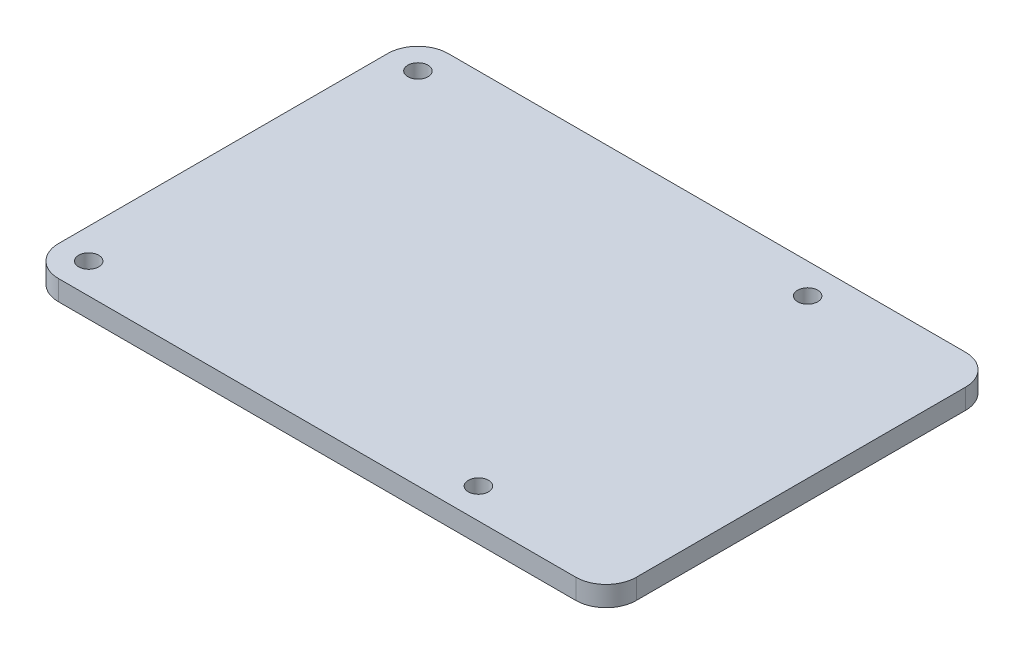
ISO-10303-21;
HEADER;
FILE_DESCRIPTION(('STEP AP214'),'2;1');
FILE_NAME('part.step','',(''),(''),'','','');
FILE_SCHEMA(('AUTOMOTIVE_DESIGN { 1 0 10303 214 1 1 1 1 }'));
ENDSEC;
DATA;
#1=APPLICATION_CONTEXT('core data for automotive mechanical design processes');
#2=APPLICATION_PROTOCOL_DEFINITION('international standard','automotive_design',2000,#1);
#3=PRODUCT_CONTEXT('',#1,'mechanical');
#4=PRODUCT('Part','Part','',(#3));
#5=PRODUCT_RELATED_PRODUCT_CATEGORY('part','',(#4));
#6=PRODUCT_DEFINITION_FORMATION('','',#4);
#7=PRODUCT_DEFINITION_CONTEXT('part definition',#1,'design');
#8=PRODUCT_DEFINITION('design','',#6,#7);
#9=PRODUCT_DEFINITION_SHAPE('','',#8);
#10=(LENGTH_UNIT() NAMED_UNIT(*) SI_UNIT(.MILLI.,.METRE.));
#11=(NAMED_UNIT(*) PLANE_ANGLE_UNIT() SI_UNIT($,.RADIAN.));
#12=(NAMED_UNIT(*) SI_UNIT($,.STERADIAN.) SOLID_ANGLE_UNIT());
#13=UNCERTAINTY_MEASURE_WITH_UNIT(LENGTH_MEASURE(1.E-05),#10,'distance_accuracy_value','');
#14=(GEOMETRIC_REPRESENTATION_CONTEXT(3) GLOBAL_UNCERTAINTY_ASSIGNED_CONTEXT((#13)) GLOBAL_UNIT_ASSIGNED_CONTEXT((#10,
#11,#12)) REPRESENTATION_CONTEXT('',''));
#15=CARTESIAN_POINT('',(0.,0.,0.));
#16=DIRECTION('',(0.,0.,1.));
#17=DIRECTION('',(1.,0.,0.));
#18=AXIS2_PLACEMENT_3D('',#15,#16,#17);
#19=CARTESIAN_POINT('',(39.4233867413842,3.,7.76723290820551));
#20=DIRECTION('',(0.,-1.,0.));
#21=DIRECTION('',(0.,0.,-1.));
#22=AXIS2_PLACEMENT_3D('',#19,#20,#21);
#23=PLANE('',#22);
#24=CARTESIAN_POINT('',(39.4233867413842,3.,7.76723290820551));
#25=DIRECTION('',(0.,1.,0.));
#26=DIRECTION('',(0.,0.,-1.));
#27=AXIS2_PLACEMENT_3D('',#24,#25,#26);
#28=CIRCLE('',#27,4.5);
#29=CARTESIAN_POINT('',(39.4233867413842,3.,12.2672329082055));
#30=VERTEX_POINT('',#29);
#31=CARTESIAN_POINT('',(43.9233867413842,3.,7.76723290820548));
#32=VERTEX_POINT('',#31);
#33=EDGE_CURVE('E164',#30,#32,#28,.T.);
#34=ORIENTED_EDGE('',*,*,#33,.T.);
#35=DIRECTION('',(0.,0.,-1.));
#36=VECTOR('',#35,1.);
#37=CARTESIAN_POINT('',(43.9233867413842,3.,-41.2327670917945));
#38=LINE('',#37,#36);
#39=CARTESIAN_POINT('',(43.9233867413842,3.,-41.2327670917945));
#40=VERTEX_POINT('',#39);
#41=EDGE_CURVE('E100',#32,#40,#38,.T.);
#42=ORIENTED_EDGE('',*,*,#41,.T.);
#43=CARTESIAN_POINT('',(39.4233867413842,3.,-41.2327670917945));
#44=DIRECTION('',(0.,1.,0.));
#45=DIRECTION('',(0.,0.,1.));
#46=AXIS2_PLACEMENT_3D('',#43,#44,#45);
#47=CIRCLE('',#46,4.5);
#48=CARTESIAN_POINT('',(39.4233867413842,3.,-45.7327670917945));
#49=VERTEX_POINT('',#48);
#50=EDGE_CURVE('E185',#40,#49,#47,.T.);
#51=ORIENTED_EDGE('',*,*,#50,.T.);
#52=DIRECTION('',(-1.,0.,0.));
#53=VECTOR('',#52,1.);
#54=CARTESIAN_POINT('',(-37.5766132586158,3.,-45.7327670917945));
#55=LINE('',#54,#53);
#56=CARTESIAN_POINT('',(-37.5766132586158,3.,-45.7327670917945));
#57=VERTEX_POINT('',#56);
#58=EDGE_CURVE('E199',#49,#57,#55,.T.);
#59=ORIENTED_EDGE('',*,*,#58,.T.);
#60=CARTESIAN_POINT('',(-37.5766132586158,3.,-41.2327670917945));
#61=DIRECTION('',(0.,1.,0.));
#62=DIRECTION('',(0.,0.,1.));
#63=AXIS2_PLACEMENT_3D('',#60,#61,#62);
#64=CIRCLE('',#63,4.5);
#65=CARTESIAN_POINT('',(-42.0766132586158,3.,-41.2327670917945));
#66=VERTEX_POINT('',#65);
#67=EDGE_CURVE('E119',#57,#66,#64,.T.);
#68=ORIENTED_EDGE('',*,*,#67,.T.);
#69=DIRECTION('',(0.,0.,1.));
#70=VECTOR('',#69,1.);
#71=CARTESIAN_POINT('',(-42.0766132586158,3.,7.76723290820551));
#72=LINE('',#71,#70);
#73=CARTESIAN_POINT('',(-42.0766132586158,3.,7.76723290820551));
#74=VERTEX_POINT('',#73);
#75=EDGE_CURVE('E113',#66,#74,#72,.T.);
#76=ORIENTED_EDGE('',*,*,#75,.T.);
#77=CARTESIAN_POINT('',(-37.5766132586158,3.,7.76723290820551));
#78=DIRECTION('',(0.,1.,0.));
#79=DIRECTION('',(0.,0.,1.));
#80=AXIS2_PLACEMENT_3D('',#77,#78,#79);
#81=CIRCLE('',#80,4.5);
#82=CARTESIAN_POINT('',(-37.5766132586158,3.,12.2672329082055));
#83=VERTEX_POINT('',#82);
#84=EDGE_CURVE('E117',#74,#83,#81,.T.);
#85=ORIENTED_EDGE('',*,*,#84,.T.);
#86=DIRECTION('',(1.,0.,0.));
#87=VECTOR('',#86,1.);
#88=CARTESIAN_POINT('',(-37.5766132586158,3.,12.2672329082055));
#89=LINE('',#88,#87);
#90=EDGE_CURVE('E57',#83,#30,#89,.T.);
#91=ORIENTED_EDGE('',*,*,#90,.T.);
#92=EDGE_LOOP('',(#34,#42,#51,#59,#68,#76,#85,#91));
#93=FACE_BOUND('',#92,.T.);
#94=CARTESIAN_POINT('',(-37.5766132586158,3.,-41.2327670917945));
#95=DIRECTION('',(0.,1.,0.));
#96=DIRECTION('',(0.,0.,1.));
#97=AXIS2_PLACEMENT_3D('',#94,#95,#96);
#98=CIRCLE('',#97,1.5);
#99=CARTESIAN_POINT('',(-37.5766132586158,3.,-39.7327670917945));
#100=VERTEX_POINT('',#99);
#101=EDGE_CURVE('E146',#100,#100,#98,.T.);
#102=ORIENTED_EDGE('',*,*,#101,.F.);
#103=EDGE_LOOP('',(#102));
#104=FACE_BOUND('',#103,.T.);
#105=CARTESIAN_POINT('',(20.4233867413842,3.,-41.2327670917945));
#106=DIRECTION('',(0.,1.,0.));
#107=DIRECTION('',(0.,0.,1.));
#108=AXIS2_PLACEMENT_3D('',#105,#106,#107);
#109=CIRCLE('',#108,1.5);
#110=CARTESIAN_POINT('',(20.4233867413842,3.,-39.7327670917945));
#111=VERTEX_POINT('',#110);
#112=EDGE_CURVE('E213',#111,#111,#109,.T.);
#113=ORIENTED_EDGE('',*,*,#112,.F.);
#114=EDGE_LOOP('',(#113));
#115=FACE_BOUND('',#114,.T.);
#116=CARTESIAN_POINT('',(-37.5766132586158,3.,7.76723290820551));
#117=DIRECTION('',(0.,1.,0.));
#118=DIRECTION('',(0.,0.,1.));
#119=AXIS2_PLACEMENT_3D('',#116,#117,#118);
#120=CIRCLE('',#119,1.5);
#121=CARTESIAN_POINT('',(-37.5766132586158,3.,9.26723290820551));
#122=VERTEX_POINT('',#121);
#123=EDGE_CURVE('E221',#122,#122,#120,.T.);
#124=ORIENTED_EDGE('',*,*,#123,.F.);
#125=EDGE_LOOP('',(#124));
#126=FACE_BOUND('',#125,.T.);
#127=CARTESIAN_POINT('',(20.4233867413842,3.,7.76723290820551));
#128=DIRECTION('',(0.,1.,0.));
#129=DIRECTION('',(0.,0.,1.));
#130=AXIS2_PLACEMENT_3D('',#127,#128,#129);
#131=CIRCLE('',#130,1.5);
#132=CARTESIAN_POINT('',(20.4233867413842,3.,9.26723290820551));
#133=VERTEX_POINT('',#132);
#134=EDGE_CURVE('E229',#133,#133,#131,.T.);
#135=ORIENTED_EDGE('',*,*,#134,.F.);
#136=EDGE_LOOP('',(#135));
#137=FACE_BOUND('',#136,.T.);
#138=ADVANCED_FACE('F39',(#93,#104,#115,#126,#137),#23,.F.);
#139=CARTESIAN_POINT('',(39.4233867413842,0.,7.76723290820551));
#140=DIRECTION('',(0.,-1.,0.));
#141=DIRECTION('',(0.,0.,-1.));
#142=AXIS2_PLACEMENT_3D('',#139,#140,#141);
#143=PLANE('',#142);
#144=CARTESIAN_POINT('',(-37.5766132586158,0.,7.76723290820551));
#145=DIRECTION('',(0.,1.,0.));
#146=DIRECTION('',(0.,0.,1.));
#147=AXIS2_PLACEMENT_3D('',#144,#145,#146);
#148=CIRCLE('',#147,1.5);
#149=CARTESIAN_POINT('',(-37.5766132586158,0.,9.26723290820551));
#150=VERTEX_POINT('',#149);
#151=EDGE_CURVE('E225',#150,#150,#148,.T.);
#152=ORIENTED_EDGE('',*,*,#151,.T.);
#153=EDGE_LOOP('',(#152));
#154=FACE_BOUND('',#153,.T.);
#155=CARTESIAN_POINT('',(-37.5766132586158,0.,-41.2327670917945));
#156=DIRECTION('',(0.,1.,0.));
#157=DIRECTION('',(0.,0.,1.));
#158=AXIS2_PLACEMENT_3D('',#155,#156,#157);
#159=CIRCLE('',#158,1.5);
#160=CARTESIAN_POINT('',(-37.5766132586158,0.,-39.7327670917945));
#161=VERTEX_POINT('',#160);
#162=EDGE_CURVE('E209',#161,#161,#159,.T.);
#163=ORIENTED_EDGE('',*,*,#162,.T.);
#164=EDGE_LOOP('',(#163));
#165=FACE_BOUND('',#164,.T.);
#166=CARTESIAN_POINT('',(39.4233867413842,0.,7.76723290820551));
#167=DIRECTION('',(0.,1.,0.));
#168=DIRECTION('',(0.,0.,-1.));
#169=AXIS2_PLACEMENT_3D('',#166,#167,#168);
#170=CIRCLE('',#169,4.5);
#171=CARTESIAN_POINT('',(39.4233867413842,0.,12.2672329082055));
#172=VERTEX_POINT('',#171);
#173=CARTESIAN_POINT('',(43.9233867413842,0.,7.76723290820548));
#174=VERTEX_POINT('',#173);
#175=EDGE_CURVE('E141',#172,#174,#170,.T.);
#176=ORIENTED_EDGE('',*,*,#175,.F.);
#177=DIRECTION('',(1.,0.,0.));
#178=VECTOR('',#177,1.);
#179=CARTESIAN_POINT('',(-37.5766132586158,0.,12.2672329082055));
#180=LINE('',#179,#178);
#181=CARTESIAN_POINT('',(-37.5766132586158,0.,12.2672329082055));
#182=VERTEX_POINT('',#181);
#183=EDGE_CURVE('E92',#182,#172,#180,.T.);
#184=ORIENTED_EDGE('',*,*,#183,.F.);
#185=CARTESIAN_POINT('',(-37.5766132586158,0.,7.76723290820551));
#186=DIRECTION('',(0.,1.,0.));
#187=DIRECTION('',(0.,0.,1.));
#188=AXIS2_PLACEMENT_3D('',#185,#186,#187);
#189=CIRCLE('',#188,4.5);
#190=CARTESIAN_POINT('',(-42.0766132586158,0.,7.76723290820551));
#191=VERTEX_POINT('',#190);
#192=EDGE_CURVE('E86',#191,#182,#189,.T.);
#193=ORIENTED_EDGE('',*,*,#192,.F.);
#194=DIRECTION('',(0.,0.,1.));
#195=VECTOR('',#194,1.);
#196=CARTESIAN_POINT('',(-42.0766132586158,0.,7.76723290820551));
#197=LINE('',#196,#195);
#198=CARTESIAN_POINT('',(-42.0766132586158,0.,-41.2327670917945));
#199=VERTEX_POINT('',#198);
#200=EDGE_CURVE('E128',#199,#191,#197,.T.);
#201=ORIENTED_EDGE('',*,*,#200,.F.);
#202=CARTESIAN_POINT('',(-37.5766132586158,0.,-41.2327670917945));
#203=DIRECTION('',(0.,1.,0.));
#204=DIRECTION('',(0.,0.,1.));
#205=AXIS2_PLACEMENT_3D('',#202,#203,#204);
#206=CIRCLE('',#205,4.5);
#207=CARTESIAN_POINT('',(-37.5766132586158,0.,-45.7327670917945));
#208=VERTEX_POINT('',#207);
#209=EDGE_CURVE('E155',#208,#199,#206,.T.);
#210=ORIENTED_EDGE('',*,*,#209,.F.);
#211=DIRECTION('',(-1.,0.,0.));
#212=VECTOR('',#211,1.);
#213=CARTESIAN_POINT('',(-37.5766132586158,0.,-45.7327670917945));
#214=LINE('',#213,#212);
#215=CARTESIAN_POINT('',(39.4233867413842,0.,-45.7327670917945));
#216=VERTEX_POINT('',#215);
#217=EDGE_CURVE('E152',#216,#208,#214,.T.);
#218=ORIENTED_EDGE('',*,*,#217,.F.);
#219=CARTESIAN_POINT('',(39.4233867413842,0.,-41.2327670917945));
#220=DIRECTION('',(0.,1.,0.));
#221=DIRECTION('',(0.,0.,1.));
#222=AXIS2_PLACEMENT_3D('',#219,#220,#221);
#223=CIRCLE('',#222,4.5);
#224=CARTESIAN_POINT('',(43.9233867413842,0.,-41.2327670917945));
#225=VERTEX_POINT('',#224);
#226=EDGE_CURVE('E149',#225,#216,#223,.T.);
#227=ORIENTED_EDGE('',*,*,#226,.F.);
#228=DIRECTION('',(0.,0.,-1.));
#229=VECTOR('',#228,1.);
#230=CARTESIAN_POINT('',(43.9233867413842,0.,-41.2327670917945));
#231=LINE('',#230,#229);
#232=EDGE_CURVE('E145',#174,#225,#231,.T.);
#233=ORIENTED_EDGE('',*,*,#232,.F.);
#234=EDGE_LOOP('',(#176,#184,#193,#201,#210,#218,#227,#233));
#235=FACE_BOUND('',#234,.T.);
#236=CARTESIAN_POINT('',(20.4233867413842,0.,-41.2327670917945));
#237=DIRECTION('',(0.,1.,0.));
#238=DIRECTION('',(0.,0.,1.));
#239=AXIS2_PLACEMENT_3D('',#236,#237,#238);
#240=CIRCLE('',#239,1.5);
#241=CARTESIAN_POINT('',(20.4233867413842,0.,-39.7327670917945));
#242=VERTEX_POINT('',#241);
#243=EDGE_CURVE('E217',#242,#242,#240,.T.);
#244=ORIENTED_EDGE('',*,*,#243,.T.);
#245=EDGE_LOOP('',(#244));
#246=FACE_BOUND('',#245,.T.);
#247=CARTESIAN_POINT('',(20.4233867413842,0.,7.76723290820551));
#248=DIRECTION('',(0.,1.,0.));
#249=DIRECTION('',(0.,0.,1.));
#250=AXIS2_PLACEMENT_3D('',#247,#248,#249);
#251=CIRCLE('',#250,1.5);
#252=CARTESIAN_POINT('',(20.4233867413842,0.,9.26723290820551));
#253=VERTEX_POINT('',#252);
#254=EDGE_CURVE('E233',#253,#253,#251,.T.);
#255=ORIENTED_EDGE('',*,*,#254,.T.);
#256=EDGE_LOOP('',(#255));
#257=FACE_BOUND('',#256,.T.);
#258=ADVANCED_FACE('F189',(#154,#165,#235,#246,#257),#143,.T.);
#259=CARTESIAN_POINT('',(39.4233867413842,3.,7.76723290820551));
#260=DIRECTION('',(0.,-1.,0.));
#261=DIRECTION('',(0.,0.,-1.));
#262=AXIS2_PLACEMENT_3D('',#259,#260,#261);
#263=CYLINDRICAL_SURFACE('',#262,4.5);
#264=ORIENTED_EDGE('',*,*,#175,.T.);
#265=DIRECTION('',(0.,-1.,0.));
#266=VECTOR('',#265,1.);
#267=CARTESIAN_POINT('',(43.9233867413842,3.,7.76723290820548));
#268=LINE('',#267,#266);
#269=EDGE_CURVE('E11',#32,#174,#268,.T.);
#270=ORIENTED_EDGE('',*,*,#269,.F.);
#271=ORIENTED_EDGE('',*,*,#33,.F.);
#272=DIRECTION('',(0.,-1.,0.));
#273=VECTOR('',#272,1.);
#274=CARTESIAN_POINT('',(39.4233867413842,3.,12.2672329082055));
#275=LINE('',#274,#273);
#276=EDGE_CURVE('E137',#30,#172,#275,.T.);
#277=ORIENTED_EDGE('',*,*,#276,.T.);
#278=EDGE_LOOP('',(#264,#270,#271,#277));
#279=FACE_BOUND('',#278,.T.);
#280=ADVANCED_FACE('F41',(#279),#263,.T.);
#281=CARTESIAN_POINT('',(43.9233867413842,3.,-41.2327670917945));
#282=DIRECTION('',(-1.,0.,0.));
#283=DIRECTION('',(0.,0.,1.));
#284=AXIS2_PLACEMENT_3D('',#281,#282,#283);
#285=PLANE('',#284);
#286=ORIENTED_EDGE('',*,*,#232,.T.);
#287=DIRECTION('',(0.,-1.,0.));
#288=VECTOR('',#287,1.);
#289=CARTESIAN_POINT('',(43.9233867413842,3.,-41.2327670917945));
#290=LINE('',#289,#288);
#291=EDGE_CURVE('E49',#40,#225,#290,.T.);
#292=ORIENTED_EDGE('',*,*,#291,.F.);
#293=ORIENTED_EDGE('',*,*,#41,.F.);
#294=ORIENTED_EDGE('',*,*,#269,.T.);
#295=EDGE_LOOP('',(#286,#292,#293,#294));
#296=FACE_BOUND('',#295,.T.);
#297=ADVANCED_FACE('F267',(#296),#285,.F.);
#298=CARTESIAN_POINT('',(39.4233867413842,3.,-41.2327670917945));
#299=DIRECTION('',(0.,-1.,0.));
#300=DIRECTION('',(0.,0.,-1.));
#301=AXIS2_PLACEMENT_3D('',#298,#299,#300);
#302=CYLINDRICAL_SURFACE('',#301,4.5);
#303=ORIENTED_EDGE('',*,*,#226,.T.);
#304=DIRECTION('',(0.,-1.,0.));
#305=VECTOR('',#304,1.);
#306=CARTESIAN_POINT('',(39.4233867413842,3.,-45.7327670917945));
#307=LINE('',#306,#305);
#308=EDGE_CURVE('E175',#49,#216,#307,.T.);
#309=ORIENTED_EDGE('',*,*,#308,.F.);
#310=ORIENTED_EDGE('',*,*,#50,.F.);
#311=ORIENTED_EDGE('',*,*,#291,.T.);
#312=EDGE_LOOP('',(#303,#309,#310,#311));
#313=FACE_BOUND('',#312,.T.);
#314=ADVANCED_FACE('F183',(#313),#302,.T.);
#315=CARTESIAN_POINT('',(-37.5766132586158,3.,-45.7327670917945));
#316=DIRECTION('',(0.,0.,1.));
#317=DIRECTION('',(1.,0.,0.));
#318=AXIS2_PLACEMENT_3D('',#315,#316,#317);
#319=PLANE('',#318);
#320=ORIENTED_EDGE('',*,*,#217,.T.);
#321=DIRECTION('',(0.,-1.,0.));
#322=VECTOR('',#321,1.);
#323=CARTESIAN_POINT('',(-37.5766132586158,3.,-45.7327670917945));
#324=LINE('',#323,#322);
#325=EDGE_CURVE('E171',#57,#208,#324,.T.);
#326=ORIENTED_EDGE('',*,*,#325,.F.);
#327=ORIENTED_EDGE('',*,*,#58,.F.);
#328=ORIENTED_EDGE('',*,*,#308,.T.);
#329=EDGE_LOOP('',(#320,#326,#327,#328));
#330=FACE_BOUND('',#329,.T.);
#331=ADVANCED_FACE('F194',(#330),#319,.F.);
#332=CARTESIAN_POINT('',(-37.5766132586158,3.,-41.2327670917945));
#333=DIRECTION('',(0.,-1.,0.));
#334=DIRECTION('',(0.,0.,-1.));
#335=AXIS2_PLACEMENT_3D('',#332,#333,#334);
#336=CYLINDRICAL_SURFACE('',#335,4.5);
#337=ORIENTED_EDGE('',*,*,#209,.T.);
#338=DIRECTION('',(0.,-1.,0.));
#339=VECTOR('',#338,1.);
#340=CARTESIAN_POINT('',(-42.0766132586158,3.,-41.2327670917945));
#341=LINE('',#340,#339);
#342=EDGE_CURVE('E130',#66,#199,#341,.T.);
#343=ORIENTED_EDGE('',*,*,#342,.F.);
#344=ORIENTED_EDGE('',*,*,#67,.F.);
#345=ORIENTED_EDGE('',*,*,#325,.T.);
#346=EDGE_LOOP('',(#337,#343,#344,#345));
#347=FACE_BOUND('',#346,.T.);
#348=ADVANCED_FACE('F197',(#347),#336,.T.);
#349=CARTESIAN_POINT('',(-42.0766132586158,3.,7.76723290820551));
#350=DIRECTION('',(1.,0.,0.));
#351=DIRECTION('',(0.,0.,-1.));
#352=AXIS2_PLACEMENT_3D('',#349,#350,#351);
#353=PLANE('',#352);
#354=ORIENTED_EDGE('',*,*,#200,.T.);
#355=DIRECTION('',(0.,-1.,0.));
#356=VECTOR('',#355,1.);
#357=CARTESIAN_POINT('',(-42.0766132586158,3.,7.76723290820551));
#358=LINE('',#357,#356);
#359=EDGE_CURVE('E125',#74,#191,#358,.T.);
#360=ORIENTED_EDGE('',*,*,#359,.F.);
#361=ORIENTED_EDGE('',*,*,#75,.F.);
#362=ORIENTED_EDGE('',*,*,#342,.T.);
#363=EDGE_LOOP('',(#354,#360,#361,#362));
#364=FACE_BOUND('',#363,.T.);
#365=ADVANCED_FACE('F126',(#364),#353,.F.);
#366=CARTESIAN_POINT('',(-37.5766132586158,3.,7.76723290820551));
#367=DIRECTION('',(0.,-1.,0.));
#368=DIRECTION('',(0.,0.,-1.));
#369=AXIS2_PLACEMENT_3D('',#366,#367,#368);
#370=CYLINDRICAL_SURFACE('',#369,4.5);
#371=ORIENTED_EDGE('',*,*,#192,.T.);
#372=DIRECTION('',(0.,-1.,0.));
#373=VECTOR('',#372,1.);
#374=CARTESIAN_POINT('',(-37.5766132586158,3.,12.2672329082055));
#375=LINE('',#374,#373);
#376=EDGE_CURVE('E131',#83,#182,#375,.T.);
#377=ORIENTED_EDGE('',*,*,#376,.F.);
#378=ORIENTED_EDGE('',*,*,#84,.F.);
#379=ORIENTED_EDGE('',*,*,#359,.T.);
#380=EDGE_LOOP('',(#371,#377,#378,#379));
#381=FACE_BOUND('',#380,.T.);
#382=ADVANCED_FACE('F133',(#381),#370,.T.);
#383=CARTESIAN_POINT('',(-37.5766132586158,3.,12.2672329082055));
#384=DIRECTION('',(0.,0.,-1.));
#385=DIRECTION('',(-1.,0.,0.));
#386=AXIS2_PLACEMENT_3D('',#383,#384,#385);
#387=PLANE('',#386);
#388=ORIENTED_EDGE('',*,*,#183,.T.);
#389=ORIENTED_EDGE('',*,*,#276,.F.);
#390=ORIENTED_EDGE('',*,*,#90,.F.);
#391=ORIENTED_EDGE('',*,*,#376,.T.);
#392=EDGE_LOOP('',(#388,#389,#390,#391));
#393=FACE_BOUND('',#392,.T.);
#394=ADVANCED_FACE('F255',(#393),#387,.F.);
#395=CARTESIAN_POINT('',(-37.5766132586158,3.,-41.2327670917945));
#396=DIRECTION('',(0.,-1.,0.));
#397=DIRECTION('',(0.,0.,-1.));
#398=AXIS2_PLACEMENT_3D('',#395,#396,#397);
#399=CYLINDRICAL_SURFACE('',#398,1.5);
#400=ORIENTED_EDGE('',*,*,#101,.T.);
#401=EDGE_LOOP('',(#400));
#402=FACE_BOUND('',#401,.T.);
#403=ORIENTED_EDGE('',*,*,#162,.F.);
#404=EDGE_LOOP('',(#403));
#405=FACE_BOUND('',#404,.T.);
#406=ADVANCED_FACE('F252',(#402,#405),#399,.F.);
#407=CARTESIAN_POINT('',(20.4233867413842,3.,-41.2327670917945));
#408=DIRECTION('',(0.,-1.,0.));
#409=DIRECTION('',(0.,0.,-1.));
#410=AXIS2_PLACEMENT_3D('',#407,#408,#409);
#411=CYLINDRICAL_SURFACE('',#410,1.5);
#412=ORIENTED_EDGE('',*,*,#112,.T.);
#413=EDGE_LOOP('',(#412));
#414=FACE_BOUND('',#413,.T.);
#415=ORIENTED_EDGE('',*,*,#243,.F.);
#416=EDGE_LOOP('',(#415));
#417=FACE_BOUND('',#416,.T.);
#418=ADVANCED_FACE('F331',(#414,#417),#411,.F.);
#419=CARTESIAN_POINT('',(-37.5766132586158,3.,7.76723290820551));
#420=DIRECTION('',(0.,-1.,0.));
#421=DIRECTION('',(0.,0.,-1.));
#422=AXIS2_PLACEMENT_3D('',#419,#420,#421);
#423=CYLINDRICAL_SURFACE('',#422,1.5);
#424=ORIENTED_EDGE('',*,*,#123,.T.);
#425=EDGE_LOOP('',(#424));
#426=FACE_BOUND('',#425,.T.);
#427=ORIENTED_EDGE('',*,*,#151,.F.);
#428=EDGE_LOOP('',(#427));
#429=FACE_BOUND('',#428,.T.);
#430=ADVANCED_FACE('F339',(#426,#429),#423,.F.);
#431=CARTESIAN_POINT('',(20.4233867413842,3.,7.76723290820551));
#432=DIRECTION('',(0.,-1.,0.));
#433=DIRECTION('',(0.,0.,-1.));
#434=AXIS2_PLACEMENT_3D('',#431,#432,#433);
#435=CYLINDRICAL_SURFACE('',#434,1.5);
#436=ORIENTED_EDGE('',*,*,#134,.T.);
#437=EDGE_LOOP('',(#436));
#438=FACE_BOUND('',#437,.T.);
#439=ORIENTED_EDGE('',*,*,#254,.F.);
#440=EDGE_LOOP('',(#439));
#441=FACE_BOUND('',#440,.T.);
#442=ADVANCED_FACE('F241',(#438,#441),#435,.F.);
#443=CLOSED_SHELL('',(#138,#258,#280,#297,#314,#331,#348,#365,#382,#394,#406,#418,#430,#442));
#444=MANIFOLD_SOLID_BREP('B2',#443);
#445=ADVANCED_BREP_SHAPE_REPRESENTATION('',(#18,#444),#14);
#446=SHAPE_DEFINITION_REPRESENTATION(#9,#445);
ENDSEC;
END-ISO-10303-21;
